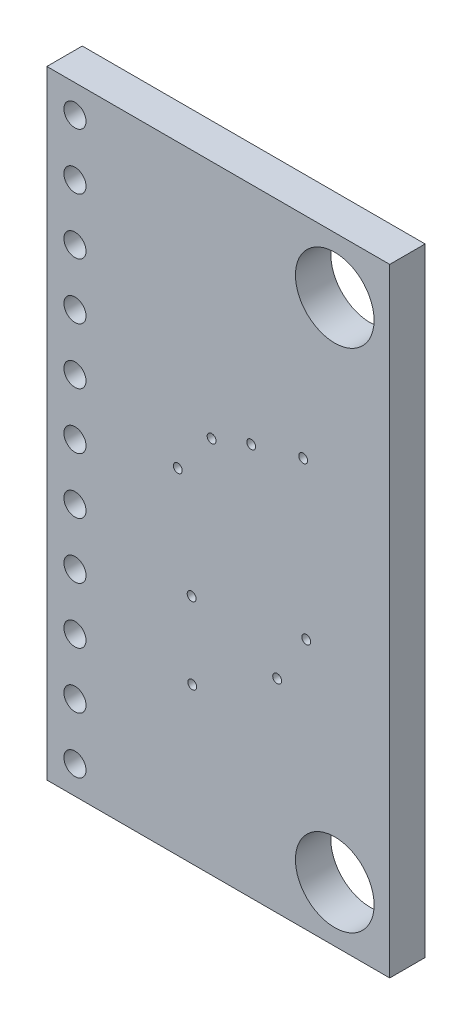
ISO-10303-21;
HEADER;
FILE_DESCRIPTION(('STEP AP214'),'2;1');
FILE_NAME('part.step','',(''),(''),'','','');
FILE_SCHEMA(('AUTOMOTIVE_DESIGN { 1 0 10303 214 1 1 1 1 }'));
ENDSEC;
DATA;
#1=APPLICATION_CONTEXT('core data for automotive mechanical design processes');
#2=APPLICATION_PROTOCOL_DEFINITION('international standard','automotive_design',2000,#1);
#3=PRODUCT_CONTEXT('',#1,'mechanical');
#4=PRODUCT('Part','Part','',(#3));
#5=PRODUCT_RELATED_PRODUCT_CATEGORY('part','',(#4));
#6=PRODUCT_DEFINITION_FORMATION('','',#4);
#7=PRODUCT_DEFINITION_CONTEXT('part definition',#1,'design');
#8=PRODUCT_DEFINITION('design','',#6,#7);
#9=PRODUCT_DEFINITION_SHAPE('','',#8);
#10=(LENGTH_UNIT() NAMED_UNIT(*) SI_UNIT(.MILLI.,.METRE.));
#11=(NAMED_UNIT(*) PLANE_ANGLE_UNIT() SI_UNIT($,.RADIAN.));
#12=(NAMED_UNIT(*) SI_UNIT($,.STERADIAN.) SOLID_ANGLE_UNIT());
#13=UNCERTAINTY_MEASURE_WITH_UNIT(LENGTH_MEASURE(1.E-05),#10,'distance_accuracy_value','');
#14=(GEOMETRIC_REPRESENTATION_CONTEXT(3) GLOBAL_UNCERTAINTY_ASSIGNED_CONTEXT((#13)) GLOBAL_UNIT_ASSIGNED_CONTEXT((#10,
#11,#12)) REPRESENTATION_CONTEXT('',''));
#15=CARTESIAN_POINT('',(0.,0.,0.));
#16=DIRECTION('',(0.,0.,1.));
#17=DIRECTION('',(1.,0.,0.));
#18=AXIS2_PLACEMENT_3D('',#15,#16,#17);
#19=CARTESIAN_POINT('',(7.75,-13.97,1.6));
#20=DIRECTION('',(-1.,0.,0.));
#21=DIRECTION('',(0.,0.,1.));
#22=AXIS2_PLACEMENT_3D('',#19,#20,#21);
#23=PLANE('',#22);
#24=DIRECTION('',(0.,1.,0.));
#25=VECTOR('',#24,1.);
#26=CARTESIAN_POINT('',(7.75,-13.97,0.));
#27=LINE('',#26,#25);
#28=CARTESIAN_POINT('',(7.75,-13.97,0.));
#29=VERTEX_POINT('',#28);
#30=CARTESIAN_POINT('',(7.75,13.97,0.));
#31=VERTEX_POINT('',#30);
#32=EDGE_CURVE('E99',#29,#31,#27,.T.);
#33=ORIENTED_EDGE('',*,*,#32,.T.);
#34=DIRECTION('',(0.,0.,-1.));
#35=VECTOR('',#34,1.);
#36=CARTESIAN_POINT('',(7.75,13.97,1.6));
#37=LINE('',#36,#35);
#38=CARTESIAN_POINT('',(7.75,13.97,1.6));
#39=VERTEX_POINT('',#38);
#40=EDGE_CURVE('E11',#39,#31,#37,.T.);
#41=ORIENTED_EDGE('',*,*,#40,.F.);
#42=DIRECTION('',(0.,1.,0.));
#43=VECTOR('',#42,1.);
#44=CARTESIAN_POINT('',(7.75,-13.97,1.6));
#45=LINE('',#44,#43);
#46=CARTESIAN_POINT('',(7.75,-13.97,1.6));
#47=VERTEX_POINT('',#46);
#48=EDGE_CURVE('E86',#47,#39,#45,.T.);
#49=ORIENTED_EDGE('',*,*,#48,.F.);
#50=DIRECTION('',(0.,0.,-1.));
#51=VECTOR('',#50,1.);
#52=CARTESIAN_POINT('',(7.75,-13.97,1.6));
#53=LINE('',#52,#51);
#54=EDGE_CURVE('E95',#47,#29,#53,.T.);
#55=ORIENTED_EDGE('',*,*,#54,.T.);
#56=EDGE_LOOP('',(#33,#41,#49,#55));
#57=FACE_BOUND('',#56,.T.);
#58=ADVANCED_FACE('F33',(#57),#23,.F.);
#59=CARTESIAN_POINT('',(-7.75,13.97,1.6));
#60=DIRECTION('',(0.,-1.,0.));
#61=DIRECTION('',(0.,0.,-1.));
#62=AXIS2_PLACEMENT_3D('',#59,#60,#61);
#63=PLANE('',#62);
#64=DIRECTION('',(-1.,0.,0.));
#65=VECTOR('',#64,1.);
#66=CARTESIAN_POINT('',(-7.75,13.97,0.));
#67=LINE('',#66,#65);
#68=CARTESIAN_POINT('',(-7.75,13.97,0.));
#69=VERTEX_POINT('',#68);
#70=EDGE_CURVE('E90',#31,#69,#67,.T.);
#71=ORIENTED_EDGE('',*,*,#70,.T.);
#72=DIRECTION('',(0.,0.,-1.));
#73=VECTOR('',#72,1.);
#74=CARTESIAN_POINT('',(-7.75,13.97,1.6));
#75=LINE('',#74,#73);
#76=CARTESIAN_POINT('',(-7.75,13.97,1.6));
#77=VERTEX_POINT('',#76);
#78=EDGE_CURVE('E42',#77,#69,#75,.T.);
#79=ORIENTED_EDGE('',*,*,#78,.F.);
#80=DIRECTION('',(-1.,0.,0.));
#81=VECTOR('',#80,1.);
#82=CARTESIAN_POINT('',(-7.75,13.97,1.6));
#83=LINE('',#82,#81);
#84=EDGE_CURVE('E81',#39,#77,#83,.T.);
#85=ORIENTED_EDGE('',*,*,#84,.F.);
#86=ORIENTED_EDGE('',*,*,#40,.T.);
#87=EDGE_LOOP('',(#71,#79,#85,#86));
#88=FACE_BOUND('',#87,.T.);
#89=ADVANCED_FACE('F89',(#88),#63,.F.);
#90=CARTESIAN_POINT('',(-7.75,-13.97,1.6));
#91=DIRECTION('',(1.,0.,0.));
#92=DIRECTION('',(0.,0.,-1.));
#93=AXIS2_PLACEMENT_3D('',#90,#91,#92);
#94=PLANE('',#93);
#95=DIRECTION('',(0.,-1.,0.));
#96=VECTOR('',#95,1.);
#97=CARTESIAN_POINT('',(-7.75,-13.97,0.));
#98=LINE('',#97,#96);
#99=CARTESIAN_POINT('',(-7.75,-13.97,0.));
#100=VERTEX_POINT('',#99);
#101=EDGE_CURVE('E68',#69,#100,#98,.T.);
#102=ORIENTED_EDGE('',*,*,#101,.T.);
#103=DIRECTION('',(0.,0.,-1.));
#104=VECTOR('',#103,1.);
#105=CARTESIAN_POINT('',(-7.75,-13.97,1.6));
#106=LINE('',#105,#104);
#107=CARTESIAN_POINT('',(-7.75,-13.97,1.6));
#108=VERTEX_POINT('',#107);
#109=EDGE_CURVE('E91',#108,#100,#106,.T.);
#110=ORIENTED_EDGE('',*,*,#109,.F.);
#111=DIRECTION('',(0.,-1.,0.));
#112=VECTOR('',#111,1.);
#113=CARTESIAN_POINT('',(-7.75,-13.97,1.6));
#114=LINE('',#113,#112);
#115=EDGE_CURVE('E84',#77,#108,#114,.T.);
#116=ORIENTED_EDGE('',*,*,#115,.F.);
#117=ORIENTED_EDGE('',*,*,#78,.T.);
#118=EDGE_LOOP('',(#102,#110,#116,#117));
#119=FACE_BOUND('',#118,.T.);
#120=ADVANCED_FACE('F93',(#119),#94,.F.);
#121=CARTESIAN_POINT('',(-7.75,-13.97,1.6));
#122=DIRECTION('',(0.,1.,0.));
#123=DIRECTION('',(0.,0.,1.));
#124=AXIS2_PLACEMENT_3D('',#121,#122,#123);
#125=PLANE('',#124);
#126=DIRECTION('',(1.,0.,0.));
#127=VECTOR('',#126,1.);
#128=CARTESIAN_POINT('',(-7.75,-13.97,0.));
#129=LINE('',#128,#127);
#130=EDGE_CURVE('E74',#100,#29,#129,.T.);
#131=ORIENTED_EDGE('',*,*,#130,.T.);
#132=ORIENTED_EDGE('',*,*,#54,.F.);
#133=DIRECTION('',(1.,0.,0.));
#134=VECTOR('',#133,1.);
#135=CARTESIAN_POINT('',(-7.75,-13.97,1.6));
#136=LINE('',#135,#134);
#137=EDGE_CURVE('E51',#108,#47,#136,.T.);
#138=ORIENTED_EDGE('',*,*,#137,.F.);
#139=ORIENTED_EDGE('',*,*,#109,.T.);
#140=EDGE_LOOP('',(#131,#132,#138,#139));
#141=FACE_BOUND('',#140,.T.);
#142=ADVANCED_FACE('F238',(#141),#125,.F.);
#143=CARTESIAN_POINT('',(0.,0.,1.6));
#144=DIRECTION('',(0.,0.,-1.));
#145=DIRECTION('',(-1.,0.,0.));
#146=AXIS2_PLACEMENT_3D('',#143,#144,#145);
#147=PLANE('',#146);
#148=CARTESIAN_POINT('',(-1.2058381942623,-3.50049205026404,1.6));
#149=DIRECTION('',(0.,0.,1.));
#150=DIRECTION('',(1.,0.,0.));
#151=AXIS2_PLACEMENT_3D('',#148,#149,#150);
#152=CIRCLE('',#151,0.2);
#153=CARTESIAN_POINT('',(-1.0058381942623,-3.50049205026404,1.6));
#154=VERTEX_POINT('',#153);
#155=EDGE_CURVE('E194',#154,#154,#152,.T.);
#156=ORIENTED_EDGE('',*,*,#155,.F.);
#157=EDGE_LOOP('',(#156));
#158=FACE_BOUND('',#157,.T.);
#159=CARTESIAN_POINT('',(-1.17745381057963,-6.94494761075422,1.6));
#160=DIRECTION('',(0.,0.,1.));
#161=DIRECTION('',(1.,0.,0.));
#162=AXIS2_PLACEMENT_3D('',#159,#160,#161);
#163=CIRCLE('',#162,0.2);
#164=CARTESIAN_POINT('',(-0.977453810579629,-6.94494761075422,1.6));
#165=VERTEX_POINT('',#164);
#166=EDGE_CURVE('E184',#165,#165,#163,.T.);
#167=ORIENTED_EDGE('',*,*,#166,.F.);
#168=EDGE_LOOP('',(#167));
#169=FACE_BOUND('',#168,.T.);
#170=CARTESIAN_POINT('',(2.65905024371903,-4.79094013428031,1.6));
#171=DIRECTION('',(0.,0.,1.));
#172=DIRECTION('',(1.,0.,0.));
#173=AXIS2_PLACEMENT_3D('',#170,#171,#172);
#174=CIRCLE('',#173,0.2);
#175=CARTESIAN_POINT('',(2.85905024371903,-4.79094013428031,1.6));
#176=VERTEX_POINT('',#175);
#177=EDGE_CURVE('E181',#176,#176,#174,.T.);
#178=ORIENTED_EDGE('',*,*,#177,.F.);
#179=EDGE_LOOP('',(#178));
#180=FACE_BOUND('',#179,.T.);
#181=CARTESIAN_POINT('',(3.9756591839995,-2.60147181318844,1.6));
#182=DIRECTION('',(0.,0.,1.));
#183=DIRECTION('',(1.,0.,0.));
#184=AXIS2_PLACEMENT_3D('',#181,#182,#183);
#185=CIRCLE('',#184,0.2);
#186=CARTESIAN_POINT('',(4.1756591839995,-2.60147181318844,1.6));
#187=VERTEX_POINT('',#186);
#188=EDGE_CURVE('E178',#187,#187,#185,.T.);
#189=ORIENTED_EDGE('',*,*,#188,.F.);
#190=EDGE_LOOP('',(#189));
#191=FACE_BOUND('',#190,.T.);
#192=CARTESIAN_POINT('',(3.83697764353972,4.42355557202266,1.6));
#193=DIRECTION('',(0.,0.,1.));
#194=DIRECTION('',(1.,0.,0.));
#195=AXIS2_PLACEMENT_3D('',#192,#193,#194);
#196=CIRCLE('',#195,0.2);
#197=CARTESIAN_POINT('',(4.03697764353972,4.42355557202266,1.6));
#198=VERTEX_POINT('',#197);
#199=EDGE_CURVE('E174',#198,#198,#196,.T.);
#200=ORIENTED_EDGE('',*,*,#199,.F.);
#201=EDGE_LOOP('',(#200));
#202=FACE_BOUND('',#201,.T.);
#203=CARTESIAN_POINT('',(1.48675548669337,3.79147637438915,1.6));
#204=DIRECTION('',(0.,0.,1.));
#205=DIRECTION('',(1.,0.,0.));
#206=AXIS2_PLACEMENT_3D('',#203,#204,#205);
#207=CIRCLE('',#206,0.2);
#208=CARTESIAN_POINT('',(1.68675548669337,3.79147637438915,1.6));
#209=VERTEX_POINT('',#208);
#210=EDGE_CURVE('E170',#209,#209,#207,.T.);
#211=ORIENTED_EDGE('',*,*,#210,.F.);
#212=EDGE_LOOP('',(#211));
#213=FACE_BOUND('',#212,.T.);
#214=CARTESIAN_POINT('',(-0.302406534372306,3.12556684309587,1.6));
#215=DIRECTION('',(0.,0.,1.));
#216=DIRECTION('',(1.,0.,0.));
#217=AXIS2_PLACEMENT_3D('',#214,#215,#216);
#218=CIRCLE('',#217,0.2);
#219=CARTESIAN_POINT('',(-0.102406534372306,3.12556684309587,1.6));
#220=VERTEX_POINT('',#219);
#221=EDGE_CURVE('E166',#220,#220,#218,.T.);
#222=ORIENTED_EDGE('',*,*,#221,.F.);
#223=EDGE_LOOP('',(#222));
#224=FACE_BOUND('',#223,.T.);
#225=CARTESIAN_POINT('',(-1.83067084874283,1.20248762693052,1.6));
#226=DIRECTION('',(0.,0.,1.));
#227=DIRECTION('',(1.,0.,0.));
#228=AXIS2_PLACEMENT_3D('',#225,#226,#227);
#229=CIRCLE('',#228,0.2);
#230=CARTESIAN_POINT('',(-1.63067084874283,1.20248762693052,1.6));
#231=VERTEX_POINT('',#230);
#232=EDGE_CURVE('E162',#231,#231,#229,.T.);
#233=ORIENTED_EDGE('',*,*,#232,.F.);
#234=EDGE_LOOP('',(#233));
#235=FACE_BOUND('',#234,.T.);
#236=CARTESIAN_POINT('',(5.26414257046381,-11.4640624990393,1.6));
#237=DIRECTION('',(0.,0.,1.));
#238=DIRECTION('',(1.,0.,0.));
#239=AXIS2_PLACEMENT_3D('',#236,#237,#238);
#240=CIRCLE('',#239,1.778);
#241=CARTESIAN_POINT('',(7.04214257046381,-11.4640624990393,1.6));
#242=VERTEX_POINT('',#241);
#243=EDGE_CURVE('E158',#242,#242,#240,.T.);
#244=ORIENTED_EDGE('',*,*,#243,.F.);
#245=EDGE_LOOP('',(#244));
#246=FACE_BOUND('',#245,.T.);
#247=CARTESIAN_POINT('',(5.26414257046381,11.4235459329421,1.6));
#248=DIRECTION('',(0.,0.,1.));
#249=DIRECTION('',(1.,0.,0.));
#250=AXIS2_PLACEMENT_3D('',#247,#248,#249);
#251=CIRCLE('',#250,1.778);
#252=CARTESIAN_POINT('',(7.04214257046381,11.4235459329421,1.6));
#253=VERTEX_POINT('',#252);
#254=EDGE_CURVE('E154',#253,#253,#251,.T.);
#255=ORIENTED_EDGE('',*,*,#254,.F.);
#256=EDGE_LOOP('',(#255));
#257=FACE_BOUND('',#256,.T.);
#258=CARTESIAN_POINT('',(-6.48000000000009,12.7,1.6));
#259=DIRECTION('',(0.,0.,1.));
#260=DIRECTION('',(1.,0.,0.));
#261=AXIS2_PLACEMENT_3D('',#258,#259,#260);
#262=CIRCLE('',#261,0.500000000000001);
#263=CARTESIAN_POINT('',(-5.98000000000009,12.7,1.6));
#264=VERTEX_POINT('',#263);
#265=EDGE_CURVE('E150',#264,#264,#262,.T.);
#266=ORIENTED_EDGE('',*,*,#265,.F.);
#267=EDGE_LOOP('',(#266));
#268=FACE_BOUND('',#267,.T.);
#269=CARTESIAN_POINT('',(-6.48000000000008,10.16,1.6));
#270=DIRECTION('',(0.,0.,1.));
#271=DIRECTION('',(1.,0.,0.));
#272=AXIS2_PLACEMENT_3D('',#269,#270,#271);
#273=CIRCLE('',#272,0.500000000000001);
#274=CARTESIAN_POINT('',(-5.98000000000008,10.16,1.6));
#275=VERTEX_POINT('',#274);
#276=EDGE_CURVE('E146',#275,#275,#273,.T.);
#277=ORIENTED_EDGE('',*,*,#276,.F.);
#278=EDGE_LOOP('',(#277));
#279=FACE_BOUND('',#278,.T.);
#280=CARTESIAN_POINT('',(-6.48000000000007,7.62,1.6));
#281=DIRECTION('',(0.,0.,1.));
#282=DIRECTION('',(1.,0.,0.));
#283=AXIS2_PLACEMENT_3D('',#280,#281,#282);
#284=CIRCLE('',#283,0.500000000000001);
#285=CARTESIAN_POINT('',(-5.98000000000007,7.62,1.6));
#286=VERTEX_POINT('',#285);
#287=EDGE_CURVE('E142',#286,#286,#284,.T.);
#288=ORIENTED_EDGE('',*,*,#287,.F.);
#289=EDGE_LOOP('',(#288));
#290=FACE_BOUND('',#289,.T.);
#291=CARTESIAN_POINT('',(-6.48000000000006,5.08,1.6));
#292=DIRECTION('',(0.,0.,1.));
#293=DIRECTION('',(1.,0.,0.));
#294=AXIS2_PLACEMENT_3D('',#291,#292,#293);
#295=CIRCLE('',#294,0.500000000000001);
#296=CARTESIAN_POINT('',(-5.98000000000006,5.08,1.6));
#297=VERTEX_POINT('',#296);
#298=EDGE_CURVE('E138',#297,#297,#295,.T.);
#299=ORIENTED_EDGE('',*,*,#298,.F.);
#300=EDGE_LOOP('',(#299));
#301=FACE_BOUND('',#300,.T.);
#302=CARTESIAN_POINT('',(-6.48000000000005,2.54,1.6));
#303=DIRECTION('',(0.,0.,1.));
#304=DIRECTION('',(1.,0.,0.));
#305=AXIS2_PLACEMENT_3D('',#302,#303,#304);
#306=CIRCLE('',#305,0.500000000000002);
#307=CARTESIAN_POINT('',(-5.98000000000005,2.54,1.6));
#308=VERTEX_POINT('',#307);
#309=EDGE_CURVE('E134',#308,#308,#306,.T.);
#310=ORIENTED_EDGE('',*,*,#309,.F.);
#311=EDGE_LOOP('',(#310));
#312=FACE_BOUND('',#311,.T.);
#313=CARTESIAN_POINT('',(-6.48000000000005,0.,1.6));
#314=DIRECTION('',(0.,0.,1.));
#315=DIRECTION('',(1.,0.,0.));
#316=AXIS2_PLACEMENT_3D('',#313,#314,#315);
#317=CIRCLE('',#316,0.500000000000002);
#318=CARTESIAN_POINT('',(-5.98000000000004,0.,1.6));
#319=VERTEX_POINT('',#318);
#320=EDGE_CURVE('E130',#319,#319,#317,.T.);
#321=ORIENTED_EDGE('',*,*,#320,.F.);
#322=EDGE_LOOP('',(#321));
#323=FACE_BOUND('',#322,.T.);
#324=CARTESIAN_POINT('',(-6.48000000000004,-2.54,1.6));
#325=DIRECTION('',(0.,0.,1.));
#326=DIRECTION('',(1.,0.,0.));
#327=AXIS2_PLACEMENT_3D('',#324,#325,#326);
#328=CIRCLE('',#327,0.500000000000002);
#329=CARTESIAN_POINT('',(-5.98000000000004,-2.54,1.6));
#330=VERTEX_POINT('',#329);
#331=EDGE_CURVE('E126',#330,#330,#328,.T.);
#332=ORIENTED_EDGE('',*,*,#331,.F.);
#333=EDGE_LOOP('',(#332));
#334=FACE_BOUND('',#333,.T.);
#335=CARTESIAN_POINT('',(-6.48000000000003,-5.08,1.6));
#336=DIRECTION('',(0.,0.,1.));
#337=DIRECTION('',(1.,0.,0.));
#338=AXIS2_PLACEMENT_3D('',#335,#336,#337);
#339=CIRCLE('',#338,0.500000000000002);
#340=CARTESIAN_POINT('',(-5.98000000000003,-5.08,1.6));
#341=VERTEX_POINT('',#340);
#342=EDGE_CURVE('E122',#341,#341,#339,.T.);
#343=ORIENTED_EDGE('',*,*,#342,.F.);
#344=EDGE_LOOP('',(#343));
#345=FACE_BOUND('',#344,.T.);
#346=CARTESIAN_POINT('',(-6.48000000000002,-7.62,1.6));
#347=DIRECTION('',(0.,0.,1.));
#348=DIRECTION('',(1.,0.,0.));
#349=AXIS2_PLACEMENT_3D('',#346,#347,#348);
#350=CIRCLE('',#349,0.500000000000001);
#351=CARTESIAN_POINT('',(-5.98000000000002,-7.62,1.6));
#352=VERTEX_POINT('',#351);
#353=EDGE_CURVE('E118',#352,#352,#350,.T.);
#354=ORIENTED_EDGE('',*,*,#353,.F.);
#355=EDGE_LOOP('',(#354));
#356=FACE_BOUND('',#355,.T.);
#357=CARTESIAN_POINT('',(-6.48000000000001,-10.16,1.6));
#358=DIRECTION('',(0.,0.,1.));
#359=DIRECTION('',(1.,0.,0.));
#360=AXIS2_PLACEMENT_3D('',#357,#358,#359);
#361=CIRCLE('',#360,0.500000000000001);
#362=CARTESIAN_POINT('',(-5.98000000000001,-10.16,1.6));
#363=VERTEX_POINT('',#362);
#364=EDGE_CURVE('E114',#363,#363,#361,.T.);
#365=ORIENTED_EDGE('',*,*,#364,.F.);
#366=EDGE_LOOP('',(#365));
#367=FACE_BOUND('',#366,.T.);
#368=CARTESIAN_POINT('',(-6.48,-12.7,1.6));
#369=DIRECTION('',(0.,0.,1.));
#370=DIRECTION('',(1.,0.,0.));
#371=AXIS2_PLACEMENT_3D('',#368,#369,#370);
#372=CIRCLE('',#371,0.500000000000001);
#373=CARTESIAN_POINT('',(-5.98,-12.7,1.6));
#374=VERTEX_POINT('',#373);
#375=EDGE_CURVE('E110',#374,#374,#372,.T.);
#376=ORIENTED_EDGE('',*,*,#375,.F.);
#377=EDGE_LOOP('',(#376));
#378=FACE_BOUND('',#377,.T.);
#379=ORIENTED_EDGE('',*,*,#48,.T.);
#380=ORIENTED_EDGE('',*,*,#84,.T.);
#381=ORIENTED_EDGE('',*,*,#115,.T.);
#382=ORIENTED_EDGE('',*,*,#137,.T.);
#383=EDGE_LOOP('',(#379,#380,#381,#382));
#384=FACE_BOUND('',#383,.T.);
#385=ADVANCED_FACE('F82',(#158,#169,#180,#191,#202,#213,#224,#235,#246,#257,#268,#279,#290,#301,
#312,#323,#334,#345,#356,#367,#378,#384),#147,.F.);
#386=CARTESIAN_POINT('',(0.,0.,0.));
#387=DIRECTION('',(0.,0.,-1.));
#388=DIRECTION('',(-1.,0.,0.));
#389=AXIS2_PLACEMENT_3D('',#386,#387,#388);
#390=PLANE('',#389);
#391=CARTESIAN_POINT('',(-1.2058381942623,-3.50049205026404,0.));
#392=DIRECTION('',(0.,0.,-1.));
#393=DIRECTION('',(-1.,0.,0.));
#394=AXIS2_PLACEMENT_3D('',#391,#392,#393);
#395=CIRCLE('',#394,0.2);
#396=CARTESIAN_POINT('',(-1.4058381942623,-3.50049205026404,0.));
#397=VERTEX_POINT('',#396);
#398=EDGE_CURVE('E36',#397,#397,#395,.T.);
#399=ORIENTED_EDGE('',*,*,#398,.F.);
#400=EDGE_LOOP('',(#399));
#401=FACE_BOUND('',#400,.T.);
#402=CARTESIAN_POINT('',(-1.17745381057963,-6.94494761075422,0.));
#403=DIRECTION('',(0.,0.,-1.));
#404=DIRECTION('',(-1.,0.,0.));
#405=AXIS2_PLACEMENT_3D('',#402,#403,#404);
#406=CIRCLE('',#405,0.2);
#407=CARTESIAN_POINT('',(-1.37745381057963,-6.94494761075422,0.));
#408=VERTEX_POINT('',#407);
#409=EDGE_CURVE('E182',#408,#408,#406,.T.);
#410=ORIENTED_EDGE('',*,*,#409,.F.);
#411=EDGE_LOOP('',(#410));
#412=FACE_BOUND('',#411,.T.);
#413=CARTESIAN_POINT('',(2.65905024371903,-4.79094013428031,0.));
#414=DIRECTION('',(0.,0.,-1.));
#415=DIRECTION('',(-1.,0.,0.));
#416=AXIS2_PLACEMENT_3D('',#413,#414,#415);
#417=CIRCLE('',#416,0.2);
#418=CARTESIAN_POINT('',(2.45905024371903,-4.79094013428031,0.));
#419=VERTEX_POINT('',#418);
#420=EDGE_CURVE('E179',#419,#419,#417,.T.);
#421=ORIENTED_EDGE('',*,*,#420,.F.);
#422=EDGE_LOOP('',(#421));
#423=FACE_BOUND('',#422,.T.);
#424=CARTESIAN_POINT('',(3.9756591839995,-2.60147181318844,0.));
#425=DIRECTION('',(0.,0.,-1.));
#426=DIRECTION('',(-1.,0.,0.));
#427=AXIS2_PLACEMENT_3D('',#424,#425,#426);
#428=CIRCLE('',#427,0.2);
#429=CARTESIAN_POINT('',(3.7756591839995,-2.60147181318844,0.));
#430=VERTEX_POINT('',#429);
#431=EDGE_CURVE('E175',#430,#430,#428,.T.);
#432=ORIENTED_EDGE('',*,*,#431,.F.);
#433=EDGE_LOOP('',(#432));
#434=FACE_BOUND('',#433,.T.);
#435=CARTESIAN_POINT('',(3.83697764353972,4.42355557202266,0.));
#436=DIRECTION('',(0.,0.,-1.));
#437=DIRECTION('',(-1.,0.,0.));
#438=AXIS2_PLACEMENT_3D('',#435,#436,#437);
#439=CIRCLE('',#438,0.2);
#440=CARTESIAN_POINT('',(3.63697764353972,4.42355557202266,0.));
#441=VERTEX_POINT('',#440);
#442=EDGE_CURVE('E171',#441,#441,#439,.T.);
#443=ORIENTED_EDGE('',*,*,#442,.F.);
#444=EDGE_LOOP('',(#443));
#445=FACE_BOUND('',#444,.T.);
#446=CARTESIAN_POINT('',(1.48675548669337,3.79147637438915,0.));
#447=DIRECTION('',(0.,0.,-1.));
#448=DIRECTION('',(-1.,0.,0.));
#449=AXIS2_PLACEMENT_3D('',#446,#447,#448);
#450=CIRCLE('',#449,0.2);
#451=CARTESIAN_POINT('',(1.28675548669337,3.79147637438915,0.));
#452=VERTEX_POINT('',#451);
#453=EDGE_CURVE('E167',#452,#452,#450,.T.);
#454=ORIENTED_EDGE('',*,*,#453,.F.);
#455=EDGE_LOOP('',(#454));
#456=FACE_BOUND('',#455,.T.);
#457=CARTESIAN_POINT('',(-0.302406534372306,3.12556684309587,0.));
#458=DIRECTION('',(0.,0.,-1.));
#459=DIRECTION('',(-1.,0.,0.));
#460=AXIS2_PLACEMENT_3D('',#457,#458,#459);
#461=CIRCLE('',#460,0.2);
#462=CARTESIAN_POINT('',(-0.502406534372306,3.12556684309587,0.));
#463=VERTEX_POINT('',#462);
#464=EDGE_CURVE('E163',#463,#463,#461,.T.);
#465=ORIENTED_EDGE('',*,*,#464,.F.);
#466=EDGE_LOOP('',(#465));
#467=FACE_BOUND('',#466,.T.);
#468=CARTESIAN_POINT('',(-1.83067084874283,1.20248762693052,0.));
#469=DIRECTION('',(0.,0.,-1.));
#470=DIRECTION('',(-1.,0.,0.));
#471=AXIS2_PLACEMENT_3D('',#468,#469,#470);
#472=CIRCLE('',#471,0.2);
#473=CARTESIAN_POINT('',(-2.03067084874283,1.20248762693052,0.));
#474=VERTEX_POINT('',#473);
#475=EDGE_CURVE('E159',#474,#474,#472,.T.);
#476=ORIENTED_EDGE('',*,*,#475,.F.);
#477=EDGE_LOOP('',(#476));
#478=FACE_BOUND('',#477,.T.);
#479=CARTESIAN_POINT('',(5.26414257046381,-11.4640624990393,0.));
#480=DIRECTION('',(0.,0.,-1.));
#481=DIRECTION('',(-1.,0.,0.));
#482=AXIS2_PLACEMENT_3D('',#479,#480,#481);
#483=CIRCLE('',#482,1.778);
#484=CARTESIAN_POINT('',(3.48614257046381,-11.4640624990393,0.));
#485=VERTEX_POINT('',#484);
#486=EDGE_CURVE('E155',#485,#485,#483,.T.);
#487=ORIENTED_EDGE('',*,*,#486,.F.);
#488=EDGE_LOOP('',(#487));
#489=FACE_BOUND('',#488,.T.);
#490=CARTESIAN_POINT('',(5.26414257046381,11.4235459329421,0.));
#491=DIRECTION('',(0.,0.,-1.));
#492=DIRECTION('',(-1.,0.,0.));
#493=AXIS2_PLACEMENT_3D('',#490,#491,#492);
#494=CIRCLE('',#493,1.778);
#495=CARTESIAN_POINT('',(3.48614257046381,11.4235459329421,0.));
#496=VERTEX_POINT('',#495);
#497=EDGE_CURVE('E151',#496,#496,#494,.T.);
#498=ORIENTED_EDGE('',*,*,#497,.F.);
#499=EDGE_LOOP('',(#498));
#500=FACE_BOUND('',#499,.T.);
#501=CARTESIAN_POINT('',(-6.48000000000009,12.7,0.));
#502=DIRECTION('',(0.,0.,-1.));
#503=DIRECTION('',(-1.,0.,0.));
#504=AXIS2_PLACEMENT_3D('',#501,#502,#503);
#505=CIRCLE('',#504,0.500000000000001);
#506=CARTESIAN_POINT('',(-6.98000000000009,12.7,0.));
#507=VERTEX_POINT('',#506);
#508=EDGE_CURVE('E147',#507,#507,#505,.T.);
#509=ORIENTED_EDGE('',*,*,#508,.F.);
#510=EDGE_LOOP('',(#509));
#511=FACE_BOUND('',#510,.T.);
#512=CARTESIAN_POINT('',(-6.48000000000008,10.16,0.));
#513=DIRECTION('',(0.,0.,-1.));
#514=DIRECTION('',(-1.,0.,0.));
#515=AXIS2_PLACEMENT_3D('',#512,#513,#514);
#516=CIRCLE('',#515,0.500000000000001);
#517=CARTESIAN_POINT('',(-6.98000000000008,10.16,0.));
#518=VERTEX_POINT('',#517);
#519=EDGE_CURVE('E143',#518,#518,#516,.T.);
#520=ORIENTED_EDGE('',*,*,#519,.F.);
#521=EDGE_LOOP('',(#520));
#522=FACE_BOUND('',#521,.T.);
#523=CARTESIAN_POINT('',(-6.48000000000007,7.62,0.));
#524=DIRECTION('',(0.,0.,-1.));
#525=DIRECTION('',(-1.,0.,0.));
#526=AXIS2_PLACEMENT_3D('',#523,#524,#525);
#527=CIRCLE('',#526,0.500000000000001);
#528=CARTESIAN_POINT('',(-6.98000000000007,7.62,0.));
#529=VERTEX_POINT('',#528);
#530=EDGE_CURVE('E139',#529,#529,#527,.T.);
#531=ORIENTED_EDGE('',*,*,#530,.F.);
#532=EDGE_LOOP('',(#531));
#533=FACE_BOUND('',#532,.T.);
#534=CARTESIAN_POINT('',(-6.48000000000006,5.08,0.));
#535=DIRECTION('',(0.,0.,-1.));
#536=DIRECTION('',(-1.,0.,0.));
#537=AXIS2_PLACEMENT_3D('',#534,#535,#536);
#538=CIRCLE('',#537,0.500000000000001);
#539=CARTESIAN_POINT('',(-6.98000000000006,5.08,0.));
#540=VERTEX_POINT('',#539);
#541=EDGE_CURVE('E135',#540,#540,#538,.T.);
#542=ORIENTED_EDGE('',*,*,#541,.F.);
#543=EDGE_LOOP('',(#542));
#544=FACE_BOUND('',#543,.T.);
#545=CARTESIAN_POINT('',(-6.48000000000005,2.54,0.));
#546=DIRECTION('',(0.,0.,-1.));
#547=DIRECTION('',(-1.,0.,0.));
#548=AXIS2_PLACEMENT_3D('',#545,#546,#547);
#549=CIRCLE('',#548,0.500000000000002);
#550=CARTESIAN_POINT('',(-6.98000000000006,2.54,0.));
#551=VERTEX_POINT('',#550);
#552=EDGE_CURVE('E131',#551,#551,#549,.T.);
#553=ORIENTED_EDGE('',*,*,#552,.F.);
#554=EDGE_LOOP('',(#553));
#555=FACE_BOUND('',#554,.T.);
#556=CARTESIAN_POINT('',(-6.48000000000005,0.,0.));
#557=DIRECTION('',(0.,0.,-1.));
#558=DIRECTION('',(-1.,0.,0.));
#559=AXIS2_PLACEMENT_3D('',#556,#557,#558);
#560=CIRCLE('',#559,0.500000000000002);
#561=CARTESIAN_POINT('',(-6.98000000000005,0.,0.));
#562=VERTEX_POINT('',#561);
#563=EDGE_CURVE('E127',#562,#562,#560,.T.);
#564=ORIENTED_EDGE('',*,*,#563,.F.);
#565=EDGE_LOOP('',(#564));
#566=FACE_BOUND('',#565,.T.);
#567=CARTESIAN_POINT('',(-6.48000000000004,-2.54,0.));
#568=DIRECTION('',(0.,0.,-1.));
#569=DIRECTION('',(-1.,0.,0.));
#570=AXIS2_PLACEMENT_3D('',#567,#568,#569);
#571=CIRCLE('',#570,0.500000000000002);
#572=CARTESIAN_POINT('',(-6.98000000000004,-2.54,0.));
#573=VERTEX_POINT('',#572);
#574=EDGE_CURVE('E123',#573,#573,#571,.T.);
#575=ORIENTED_EDGE('',*,*,#574,.F.);
#576=EDGE_LOOP('',(#575));
#577=FACE_BOUND('',#576,.T.);
#578=CARTESIAN_POINT('',(-6.48000000000003,-5.08,0.));
#579=DIRECTION('',(0.,0.,-1.));
#580=DIRECTION('',(-1.,0.,0.));
#581=AXIS2_PLACEMENT_3D('',#578,#579,#580);
#582=CIRCLE('',#581,0.500000000000002);
#583=CARTESIAN_POINT('',(-6.98000000000003,-5.08,0.));
#584=VERTEX_POINT('',#583);
#585=EDGE_CURVE('E119',#584,#584,#582,.T.);
#586=ORIENTED_EDGE('',*,*,#585,.F.);
#587=EDGE_LOOP('',(#586));
#588=FACE_BOUND('',#587,.T.);
#589=CARTESIAN_POINT('',(-6.48000000000002,-7.62,0.));
#590=DIRECTION('',(0.,0.,-1.));
#591=DIRECTION('',(-1.,0.,0.));
#592=AXIS2_PLACEMENT_3D('',#589,#590,#591);
#593=CIRCLE('',#592,0.500000000000001);
#594=CARTESIAN_POINT('',(-6.98000000000002,-7.62,0.));
#595=VERTEX_POINT('',#594);
#596=EDGE_CURVE('E115',#595,#595,#593,.T.);
#597=ORIENTED_EDGE('',*,*,#596,.F.);
#598=EDGE_LOOP('',(#597));
#599=FACE_BOUND('',#598,.T.);
#600=CARTESIAN_POINT('',(-6.48000000000001,-10.16,0.));
#601=DIRECTION('',(0.,0.,-1.));
#602=DIRECTION('',(-1.,0.,0.));
#603=AXIS2_PLACEMENT_3D('',#600,#601,#602);
#604=CIRCLE('',#603,0.500000000000001);
#605=CARTESIAN_POINT('',(-6.98000000000001,-10.16,0.));
#606=VERTEX_POINT('',#605);
#607=EDGE_CURVE('E111',#606,#606,#604,.T.);
#608=ORIENTED_EDGE('',*,*,#607,.F.);
#609=EDGE_LOOP('',(#608));
#610=FACE_BOUND('',#609,.T.);
#611=CARTESIAN_POINT('',(-6.48,-12.7,0.));
#612=DIRECTION('',(0.,0.,-1.));
#613=DIRECTION('',(-1.,0.,0.));
#614=AXIS2_PLACEMENT_3D('',#611,#612,#613);
#615=CIRCLE('',#614,0.500000000000001);
#616=CARTESIAN_POINT('',(-6.98,-12.7,0.));
#617=VERTEX_POINT('',#616);
#618=EDGE_CURVE('E102',#617,#617,#615,.T.);
#619=ORIENTED_EDGE('',*,*,#618,.F.);
#620=EDGE_LOOP('',(#619));
#621=FACE_BOUND('',#620,.T.);
#622=ORIENTED_EDGE('',*,*,#32,.F.);
#623=ORIENTED_EDGE('',*,*,#130,.F.);
#624=ORIENTED_EDGE('',*,*,#101,.F.);
#625=ORIENTED_EDGE('',*,*,#70,.F.);
#626=EDGE_LOOP('',(#622,#623,#624,#625));
#627=FACE_BOUND('',#626,.T.);
#628=ADVANCED_FACE('F237',(#401,#412,#423,#434,#445,#456,#467,#478,#489,#500,#511,#522,#533,
#544,#555,#566,#577,#588,#599,#610,#621,#627),#390,.T.);
#629=CARTESIAN_POINT('',(-6.48,-12.7,-0.4));
#630=DIRECTION('',(0.,0.,1.));
#631=DIRECTION('',(1.,0.,0.));
#632=AXIS2_PLACEMENT_3D('',#629,#630,#631);
#633=CYLINDRICAL_SURFACE('',#632,0.500000000000001);
#634=ORIENTED_EDGE('',*,*,#618,.T.);
#635=EDGE_LOOP('',(#634));
#636=FACE_BOUND('',#635,.T.);
#637=ORIENTED_EDGE('',*,*,#375,.T.);
#638=EDGE_LOOP('',(#637));
#639=FACE_BOUND('',#638,.T.);
#640=ADVANCED_FACE('F234',(#636,#639),#633,.F.);
#641=CARTESIAN_POINT('',(-6.48000000000001,-10.16,-0.4));
#642=DIRECTION('',(0.,0.,1.));
#643=DIRECTION('',(1.,0.,0.));
#644=AXIS2_PLACEMENT_3D('',#641,#642,#643);
#645=CYLINDRICAL_SURFACE('',#644,0.500000000000001);
#646=ORIENTED_EDGE('',*,*,#607,.T.);
#647=EDGE_LOOP('',(#646));
#648=FACE_BOUND('',#647,.T.);
#649=ORIENTED_EDGE('',*,*,#364,.T.);
#650=EDGE_LOOP('',(#649));
#651=FACE_BOUND('',#650,.T.);
#652=ADVANCED_FACE('F287',(#648,#651),#645,.F.);
#653=CARTESIAN_POINT('',(-6.48000000000002,-7.62,-0.4));
#654=DIRECTION('',(0.,0.,1.));
#655=DIRECTION('',(1.,0.,0.));
#656=AXIS2_PLACEMENT_3D('',#653,#654,#655);
#657=CYLINDRICAL_SURFACE('',#656,0.500000000000001);
#658=ORIENTED_EDGE('',*,*,#596,.T.);
#659=EDGE_LOOP('',(#658));
#660=FACE_BOUND('',#659,.T.);
#661=ORIENTED_EDGE('',*,*,#353,.T.);
#662=EDGE_LOOP('',(#661));
#663=FACE_BOUND('',#662,.T.);
#664=ADVANCED_FACE('F293',(#660,#663),#657,.F.);
#665=CARTESIAN_POINT('',(-6.48000000000003,-5.08,-0.4));
#666=DIRECTION('',(0.,0.,1.));
#667=DIRECTION('',(1.,0.,0.));
#668=AXIS2_PLACEMENT_3D('',#665,#666,#667);
#669=CYLINDRICAL_SURFACE('',#668,0.500000000000002);
#670=ORIENTED_EDGE('',*,*,#585,.T.);
#671=EDGE_LOOP('',(#670));
#672=FACE_BOUND('',#671,.T.);
#673=ORIENTED_EDGE('',*,*,#342,.T.);
#674=EDGE_LOOP('',(#673));
#675=FACE_BOUND('',#674,.T.);
#676=ADVANCED_FACE('F301',(#672,#675),#669,.F.);
#677=CARTESIAN_POINT('',(-6.48000000000004,-2.54,-0.4));
#678=DIRECTION('',(0.,0.,1.));
#679=DIRECTION('',(1.,0.,0.));
#680=AXIS2_PLACEMENT_3D('',#677,#678,#679);
#681=CYLINDRICAL_SURFACE('',#680,0.500000000000002);
#682=ORIENTED_EDGE('',*,*,#574,.T.);
#683=EDGE_LOOP('',(#682));
#684=FACE_BOUND('',#683,.T.);
#685=ORIENTED_EDGE('',*,*,#331,.T.);
#686=EDGE_LOOP('',(#685));
#687=FACE_BOUND('',#686,.T.);
#688=ADVANCED_FACE('F309',(#684,#687),#681,.F.);
#689=CARTESIAN_POINT('',(-6.48000000000005,0.,-0.4));
#690=DIRECTION('',(0.,0.,1.));
#691=DIRECTION('',(1.,0.,0.));
#692=AXIS2_PLACEMENT_3D('',#689,#690,#691);
#693=CYLINDRICAL_SURFACE('',#692,0.500000000000002);
#694=ORIENTED_EDGE('',*,*,#563,.T.);
#695=EDGE_LOOP('',(#694));
#696=FACE_BOUND('',#695,.T.);
#697=ORIENTED_EDGE('',*,*,#320,.T.);
#698=EDGE_LOOP('',(#697));
#699=FACE_BOUND('',#698,.T.);
#700=ADVANCED_FACE('F317',(#696,#699),#693,.F.);
#701=CARTESIAN_POINT('',(-6.48000000000005,2.54,-0.4));
#702=DIRECTION('',(0.,0.,1.));
#703=DIRECTION('',(1.,0.,0.));
#704=AXIS2_PLACEMENT_3D('',#701,#702,#703);
#705=CYLINDRICAL_SURFACE('',#704,0.500000000000002);
#706=ORIENTED_EDGE('',*,*,#552,.T.);
#707=EDGE_LOOP('',(#706));
#708=FACE_BOUND('',#707,.T.);
#709=ORIENTED_EDGE('',*,*,#309,.T.);
#710=EDGE_LOOP('',(#709));
#711=FACE_BOUND('',#710,.T.);
#712=ADVANCED_FACE('F325',(#708,#711),#705,.F.);
#713=CARTESIAN_POINT('',(-6.48000000000006,5.08,-0.4));
#714=DIRECTION('',(0.,0.,1.));
#715=DIRECTION('',(1.,0.,0.));
#716=AXIS2_PLACEMENT_3D('',#713,#714,#715);
#717=CYLINDRICAL_SURFACE('',#716,0.500000000000001);
#718=ORIENTED_EDGE('',*,*,#541,.T.);
#719=EDGE_LOOP('',(#718));
#720=FACE_BOUND('',#719,.T.);
#721=ORIENTED_EDGE('',*,*,#298,.T.);
#722=EDGE_LOOP('',(#721));
#723=FACE_BOUND('',#722,.T.);
#724=ADVANCED_FACE('F333',(#720,#723),#717,.F.);
#725=CARTESIAN_POINT('',(-6.48000000000007,7.62,-0.4));
#726=DIRECTION('',(0.,0.,1.));
#727=DIRECTION('',(1.,0.,0.));
#728=AXIS2_PLACEMENT_3D('',#725,#726,#727);
#729=CYLINDRICAL_SURFACE('',#728,0.500000000000001);
#730=ORIENTED_EDGE('',*,*,#530,.T.);
#731=EDGE_LOOP('',(#730));
#732=FACE_BOUND('',#731,.T.);
#733=ORIENTED_EDGE('',*,*,#287,.T.);
#734=EDGE_LOOP('',(#733));
#735=FACE_BOUND('',#734,.T.);
#736=ADVANCED_FACE('F341',(#732,#735),#729,.F.);
#737=CARTESIAN_POINT('',(-6.48000000000008,10.16,-0.4));
#738=DIRECTION('',(0.,0.,1.));
#739=DIRECTION('',(1.,0.,0.));
#740=AXIS2_PLACEMENT_3D('',#737,#738,#739);
#741=CYLINDRICAL_SURFACE('',#740,0.500000000000001);
#742=ORIENTED_EDGE('',*,*,#519,.T.);
#743=EDGE_LOOP('',(#742));
#744=FACE_BOUND('',#743,.T.);
#745=ORIENTED_EDGE('',*,*,#276,.T.);
#746=EDGE_LOOP('',(#745));
#747=FACE_BOUND('',#746,.T.);
#748=ADVANCED_FACE('F349',(#744,#747),#741,.F.);
#749=CARTESIAN_POINT('',(-6.48000000000009,12.7,-0.4));
#750=DIRECTION('',(0.,0.,1.));
#751=DIRECTION('',(1.,0.,0.));
#752=AXIS2_PLACEMENT_3D('',#749,#750,#751);
#753=CYLINDRICAL_SURFACE('',#752,0.500000000000001);
#754=ORIENTED_EDGE('',*,*,#508,.T.);
#755=EDGE_LOOP('',(#754));
#756=FACE_BOUND('',#755,.T.);
#757=ORIENTED_EDGE('',*,*,#265,.T.);
#758=EDGE_LOOP('',(#757));
#759=FACE_BOUND('',#758,.T.);
#760=ADVANCED_FACE('F357',(#756,#759),#753,.F.);
#761=CARTESIAN_POINT('',(5.26414257046381,11.4235459329421,-0.4));
#762=DIRECTION('',(0.,0.,1.));
#763=DIRECTION('',(1.,0.,0.));
#764=AXIS2_PLACEMENT_3D('',#761,#762,#763);
#765=CYLINDRICAL_SURFACE('',#764,1.778);
#766=ORIENTED_EDGE('',*,*,#497,.T.);
#767=EDGE_LOOP('',(#766));
#768=FACE_BOUND('',#767,.T.);
#769=ORIENTED_EDGE('',*,*,#254,.T.);
#770=EDGE_LOOP('',(#769));
#771=FACE_BOUND('',#770,.T.);
#772=ADVANCED_FACE('F365',(#768,#771),#765,.F.);
#773=CARTESIAN_POINT('',(5.26414257046381,-11.4640624990393,-0.4));
#774=DIRECTION('',(0.,0.,1.));
#775=DIRECTION('',(1.,0.,0.));
#776=AXIS2_PLACEMENT_3D('',#773,#774,#775);
#777=CYLINDRICAL_SURFACE('',#776,1.778);
#778=ORIENTED_EDGE('',*,*,#486,.T.);
#779=EDGE_LOOP('',(#778));
#780=FACE_BOUND('',#779,.T.);
#781=ORIENTED_EDGE('',*,*,#243,.T.);
#782=EDGE_LOOP('',(#781));
#783=FACE_BOUND('',#782,.T.);
#784=ADVANCED_FACE('F373',(#780,#783),#777,.F.);
#785=CARTESIAN_POINT('',(-1.83067084874283,1.20248762693052,-8.4));
#786=DIRECTION('',(0.,0.,1.));
#787=DIRECTION('',(1.,0.,0.));
#788=AXIS2_PLACEMENT_3D('',#785,#786,#787);
#789=CYLINDRICAL_SURFACE('',#788,0.2);
#790=ORIENTED_EDGE('',*,*,#475,.T.);
#791=EDGE_LOOP('',(#790));
#792=FACE_BOUND('',#791,.T.);
#793=ORIENTED_EDGE('',*,*,#232,.T.);
#794=EDGE_LOOP('',(#793));
#795=FACE_BOUND('',#794,.T.);
#796=ADVANCED_FACE('F380',(#792,#795),#789,.F.);
#797=CARTESIAN_POINT('',(-0.302406534372306,3.12556684309587,-8.4));
#798=DIRECTION('',(0.,0.,1.));
#799=DIRECTION('',(1.,0.,0.));
#800=AXIS2_PLACEMENT_3D('',#797,#798,#799);
#801=CYLINDRICAL_SURFACE('',#800,0.2);
#802=ORIENTED_EDGE('',*,*,#464,.T.);
#803=EDGE_LOOP('',(#802));
#804=FACE_BOUND('',#803,.T.);
#805=ORIENTED_EDGE('',*,*,#221,.T.);
#806=EDGE_LOOP('',(#805));
#807=FACE_BOUND('',#806,.T.);
#808=ADVANCED_FACE('F387',(#804,#807),#801,.F.);
#809=CARTESIAN_POINT('',(1.48675548669337,3.79147637438915,-8.4));
#810=DIRECTION('',(0.,0.,1.));
#811=DIRECTION('',(1.,0.,0.));
#812=AXIS2_PLACEMENT_3D('',#809,#810,#811);
#813=CYLINDRICAL_SURFACE('',#812,0.2);
#814=ORIENTED_EDGE('',*,*,#453,.T.);
#815=EDGE_LOOP('',(#814));
#816=FACE_BOUND('',#815,.T.);
#817=ORIENTED_EDGE('',*,*,#210,.T.);
#818=EDGE_LOOP('',(#817));
#819=FACE_BOUND('',#818,.T.);
#820=ADVANCED_FACE('F395',(#816,#819),#813,.F.);
#821=CARTESIAN_POINT('',(3.83697764353972,4.42355557202266,-8.4));
#822=DIRECTION('',(0.,0.,1.));
#823=DIRECTION('',(1.,0.,0.));
#824=AXIS2_PLACEMENT_3D('',#821,#822,#823);
#825=CYLINDRICAL_SURFACE('',#824,0.2);
#826=ORIENTED_EDGE('',*,*,#442,.T.);
#827=EDGE_LOOP('',(#826));
#828=FACE_BOUND('',#827,.T.);
#829=ORIENTED_EDGE('',*,*,#199,.T.);
#830=EDGE_LOOP('',(#829));
#831=FACE_BOUND('',#830,.T.);
#832=ADVANCED_FACE('F403',(#828,#831),#825,.F.);
#833=CARTESIAN_POINT('',(3.9756591839995,-2.60147181318844,-8.4));
#834=DIRECTION('',(0.,0.,1.));
#835=DIRECTION('',(1.,0.,0.));
#836=AXIS2_PLACEMENT_3D('',#833,#834,#835);
#837=CYLINDRICAL_SURFACE('',#836,0.2);
#838=ORIENTED_EDGE('',*,*,#431,.T.);
#839=EDGE_LOOP('',(#838));
#840=FACE_BOUND('',#839,.T.);
#841=ORIENTED_EDGE('',*,*,#188,.T.);
#842=EDGE_LOOP('',(#841));
#843=FACE_BOUND('',#842,.T.);
#844=ADVANCED_FACE('F411',(#840,#843),#837,.F.);
#845=CARTESIAN_POINT('',(2.65905024371903,-4.79094013428031,-8.4));
#846=DIRECTION('',(0.,0.,1.));
#847=DIRECTION('',(1.,0.,0.));
#848=AXIS2_PLACEMENT_3D('',#845,#846,#847);
#849=CYLINDRICAL_SURFACE('',#848,0.2);
#850=ORIENTED_EDGE('',*,*,#420,.T.);
#851=EDGE_LOOP('',(#850));
#852=FACE_BOUND('',#851,.T.);
#853=ORIENTED_EDGE('',*,*,#177,.T.);
#854=EDGE_LOOP('',(#853));
#855=FACE_BOUND('',#854,.T.);
#856=ADVANCED_FACE('F419',(#852,#855),#849,.F.);
#857=CARTESIAN_POINT('',(-1.17745381057963,-6.94494761075422,-8.4));
#858=DIRECTION('',(0.,0.,1.));
#859=DIRECTION('',(1.,0.,0.));
#860=AXIS2_PLACEMENT_3D('',#857,#858,#859);
#861=CYLINDRICAL_SURFACE('',#860,0.2);
#862=ORIENTED_EDGE('',*,*,#409,.T.);
#863=EDGE_LOOP('',(#862));
#864=FACE_BOUND('',#863,.T.);
#865=ORIENTED_EDGE('',*,*,#166,.T.);
#866=EDGE_LOOP('',(#865));
#867=FACE_BOUND('',#866,.T.);
#868=ADVANCED_FACE('F427',(#864,#867),#861,.F.);
#869=CARTESIAN_POINT('',(-1.2058381942623,-3.50049205026404,-8.4));
#870=DIRECTION('',(0.,0.,1.));
#871=DIRECTION('',(1.,0.,0.));
#872=AXIS2_PLACEMENT_3D('',#869,#870,#871);
#873=CYLINDRICAL_SURFACE('',#872,0.2);
#874=ORIENTED_EDGE('',*,*,#398,.T.);
#875=EDGE_LOOP('',(#874));
#876=FACE_BOUND('',#875,.T.);
#877=ORIENTED_EDGE('',*,*,#155,.T.);
#878=EDGE_LOOP('',(#877));
#879=FACE_BOUND('',#878,.T.);
#880=ADVANCED_FACE('F435',(#876,#879),#873,.F.);
#881=CLOSED_SHELL('',(#58,#89,#120,#142,#385,#628,#640,#652,#664,#676,#688,#700,#712,#724,#736,
#748,#760,#772,#784,#796,#808,#820,#832,#844,#856,#868,#880));
#882=MANIFOLD_SOLID_BREP('B2',#881);
#883=ADVANCED_BREP_SHAPE_REPRESENTATION('',(#18,#882),#14);
#884=SHAPE_DEFINITION_REPRESENTATION(#9,#883);
ENDSEC;
END-ISO-10303-21;
